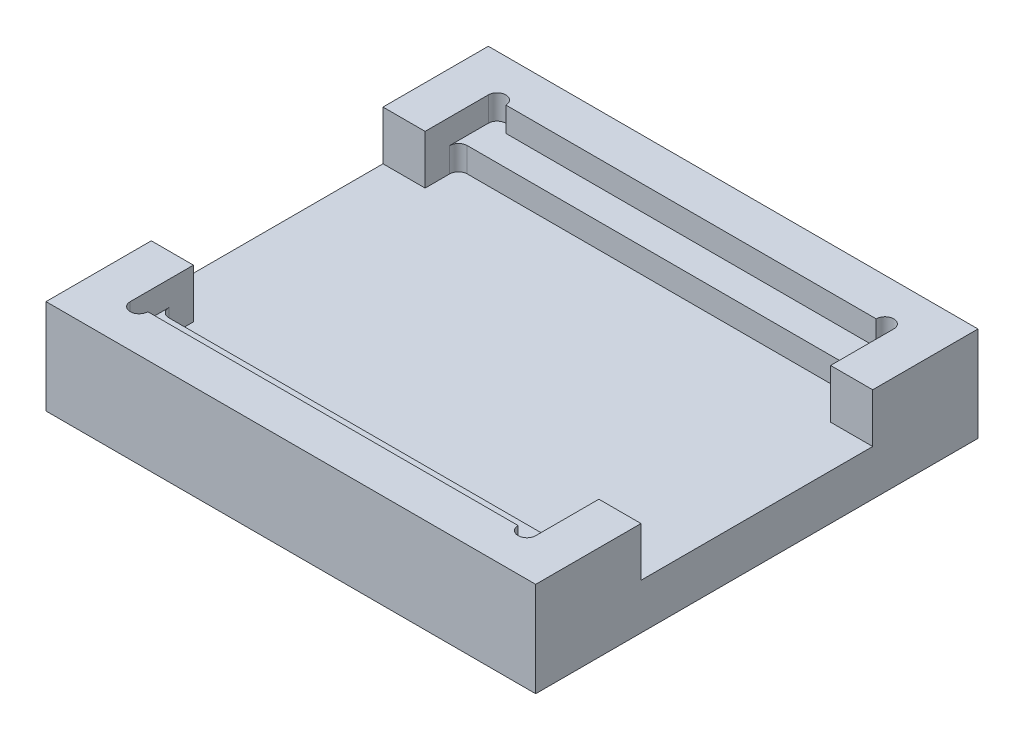
ISO-10303-21;
HEADER;
FILE_DESCRIPTION(('STEP AP214'),'2;1');
FILE_NAME('part.step','',(''),(''),'','','');
FILE_SCHEMA(('AUTOMOTIVE_DESIGN { 1 0 10303 214 1 1 1 1 }'));
ENDSEC;
DATA;
#1=APPLICATION_CONTEXT('core data for automotive mechanical design processes');
#2=APPLICATION_PROTOCOL_DEFINITION('international standard','automotive_design',2000,#1);
#3=PRODUCT_CONTEXT('',#1,'mechanical');
#4=PRODUCT('Part','Part','',(#3));
#5=PRODUCT_RELATED_PRODUCT_CATEGORY('part','',(#4));
#6=PRODUCT_DEFINITION_FORMATION('','',#4);
#7=PRODUCT_DEFINITION_CONTEXT('part definition',#1,'design');
#8=PRODUCT_DEFINITION('design','',#6,#7);
#9=PRODUCT_DEFINITION_SHAPE('','',#8);
#10=(LENGTH_UNIT() NAMED_UNIT(*) SI_UNIT(.MILLI.,.METRE.));
#11=(NAMED_UNIT(*) PLANE_ANGLE_UNIT() SI_UNIT($,.RADIAN.));
#12=(NAMED_UNIT(*) SI_UNIT($,.STERADIAN.) SOLID_ANGLE_UNIT());
#13=UNCERTAINTY_MEASURE_WITH_UNIT(LENGTH_MEASURE(1.E-05),#10,'distance_accuracy_value','');
#14=(GEOMETRIC_REPRESENTATION_CONTEXT(3) GLOBAL_UNCERTAINTY_ASSIGNED_CONTEXT((#13)) GLOBAL_UNIT_ASSIGNED_CONTEXT((#10,
#11,#12)) REPRESENTATION_CONTEXT('',''));
#15=CARTESIAN_POINT('',(0.,0.,0.));
#16=DIRECTION('',(0.,0.,1.));
#17=DIRECTION('',(1.,0.,0.));
#18=AXIS2_PLACEMENT_3D('',#15,#16,#17);
#19=CARTESIAN_POINT('',(0.,27.,0.));
#20=DIRECTION('',(0.,-1.,0.));
#21=DIRECTION('',(0.,0.,-1.));
#22=AXIS2_PLACEMENT_3D('',#19,#20,#21);
#23=PLANE('',#22);
#24=DIRECTION('',(0.,0.,-1.));
#25=VECTOR('',#24,1.);
#26=CARTESIAN_POINT('',(127.5,27.,-114.));
#27=LINE('',#26,#25);
#28=CARTESIAN_POINT('',(127.5,27.,-12.));
#29=VERTEX_POINT('',#28);
#30=CARTESIAN_POINT('',(127.5,27.,-30.));
#31=VERTEX_POINT('',#30);
#32=EDGE_CURVE('E254',#29,#31,#27,.T.);
#33=ORIENTED_EDGE('',*,*,#32,.F.);
#34=CARTESIAN_POINT('',(125.,27.,-12.));
#35=DIRECTION('',(0.,1.,0.));
#36=DIRECTION('',(0.,0.,-1.));
#37=AXIS2_PLACEMENT_3D('',#34,#35,#36);
#38=CIRCLE('',#37,2.5);
#39=CARTESIAN_POINT('',(122.5,27.,-12.));
#40=VERTEX_POINT('',#39);
#41=EDGE_CURVE('E596',#40,#29,#38,.T.);
#42=ORIENTED_EDGE('',*,*,#41,.F.);
#43=DIRECTION('',(1.,0.,0.));
#44=VECTOR('',#43,1.);
#45=CARTESIAN_POINT('',(11.9999999999999,27.,-12.));
#46=LINE('',#45,#44);
#47=CARTESIAN_POINT('',(16.9999999999999,27.,-12.));
#48=VERTEX_POINT('',#47);
#49=EDGE_CURVE('E429',#48,#40,#46,.T.);
#50=ORIENTED_EDGE('',*,*,#49,.F.);
#51=CARTESIAN_POINT('',(14.4999999999999,27.,-12.));
#52=DIRECTION('',(0.,1.,0.));
#53=DIRECTION('',(0.,0.,1.));
#54=AXIS2_PLACEMENT_3D('',#51,#52,#53);
#55=CIRCLE('',#54,2.5);
#56=CARTESIAN_POINT('',(11.9999999999999,27.,-12.));
#57=VERTEX_POINT('',#56);
#58=EDGE_CURVE('E557',#57,#48,#55,.T.);
#59=ORIENTED_EDGE('',*,*,#58,.F.);
#60=DIRECTION('',(0.,0.,1.));
#61=VECTOR('',#60,1.);
#62=CARTESIAN_POINT('',(11.9999999999999,27.,-114.));
#63=LINE('',#62,#61);
#64=CARTESIAN_POINT('',(11.9999999999999,27.,-30.));
#65=VERTEX_POINT('',#64);
#66=EDGE_CURVE('E406',#65,#57,#63,.T.);
#67=ORIENTED_EDGE('',*,*,#66,.F.);
#68=DIRECTION('',(1.,0.,0.));
#69=VECTOR('',#68,1.);
#70=CARTESIAN_POINT('',(1.37667655053519E-13,27.,-30.));
#71=LINE('',#70,#69);
#72=CARTESIAN_POINT('',(1.37667655053519E-13,27.,-30.));
#73=VERTEX_POINT('',#72);
#74=EDGE_CURVE('E504',#73,#65,#71,.T.);
#75=ORIENTED_EDGE('',*,*,#74,.F.);
#76=DIRECTION('',(0.,0.,1.));
#77=VECTOR('',#76,1.);
#78=CARTESIAN_POINT('',(0.,27.,0.));
#79=LINE('',#78,#77);
#80=CARTESIAN_POINT('',(0.,27.,0.));
#81=VERTEX_POINT('',#80);
#82=EDGE_CURVE('E283',#73,#81,#79,.T.);
#83=ORIENTED_EDGE('',*,*,#82,.T.);
#84=DIRECTION('',(1.,0.,0.));
#85=VECTOR('',#84,1.);
#86=CARTESIAN_POINT('',(0.,27.,0.));
#87=LINE('',#86,#85);
#88=CARTESIAN_POINT('',(139.5,27.,0.));
#89=VERTEX_POINT('',#88);
#90=EDGE_CURVE('E282',#81,#89,#87,.T.);
#91=ORIENTED_EDGE('',*,*,#90,.T.);
#92=DIRECTION('',(0.,0.,-1.));
#93=VECTOR('',#92,1.);
#94=CARTESIAN_POINT('',(139.5,27.,0.));
#95=LINE('',#94,#93);
#96=CARTESIAN_POINT('',(139.5,27.,-30.));
#97=VERTEX_POINT('',#96);
#98=EDGE_CURVE('E287',#89,#97,#95,.T.);
#99=ORIENTED_EDGE('',*,*,#98,.T.);
#100=DIRECTION('',(1.,0.,0.));
#101=VECTOR('',#100,1.);
#102=CARTESIAN_POINT('',(139.5,27.,-30.));
#103=LINE('',#102,#101);
#104=EDGE_CURVE('E449',#31,#97,#103,.T.);
#105=ORIENTED_EDGE('',*,*,#104,.F.);
#106=EDGE_LOOP('',(#33,#42,#50,#59,#67,#75,#83,#91,#99,#105));
#107=FACE_BOUND('',#106,.T.);
#108=ADVANCED_FACE('F39',(#107),#23,.F.);
#109=CARTESIAN_POINT('',(127.5,20.,-114.));
#110=DIRECTION('',(1.,0.,0.));
#111=DIRECTION('',(0.,0.,-1.));
#112=AXIS2_PLACEMENT_3D('',#109,#110,#111);
#113=PLANE('',#112);
#114=DIRECTION('',(0.,0.,-1.));
#115=VECTOR('',#114,1.);
#116=CARTESIAN_POINT('',(127.5,13.,-105.5));
#117=LINE('',#116,#115);
#118=CARTESIAN_POINT('',(127.5,13.,-23.));
#119=VERTEX_POINT('',#118);
#120=CARTESIAN_POINT('',(127.5,13.,-30.));
#121=VERTEX_POINT('',#120);
#122=EDGE_CURVE('E400',#119,#121,#117,.T.);
#123=ORIENTED_EDGE('',*,*,#122,.F.);
#124=DIRECTION('',(0.,1.,0.));
#125=VECTOR('',#124,1.);
#126=CARTESIAN_POINT('',(127.5,20.,-23.));
#127=LINE('',#126,#125);
#128=CARTESIAN_POINT('',(127.5,20.,-23.));
#129=VERTEX_POINT('',#128);
#130=EDGE_CURVE('E322',#119,#129,#127,.T.);
#131=ORIENTED_EDGE('',*,*,#130,.T.);
#132=DIRECTION('',(0.,0.,-1.));
#133=VECTOR('',#132,1.);
#134=CARTESIAN_POINT('',(127.5,20.,-114.));
#135=LINE('',#134,#133);
#136=CARTESIAN_POINT('',(127.5,20.,-12.));
#137=VERTEX_POINT('',#136);
#138=EDGE_CURVE('E421',#137,#129,#135,.T.);
#139=ORIENTED_EDGE('',*,*,#138,.F.);
#140=DIRECTION('',(0.,1.,0.));
#141=VECTOR('',#140,1.);
#142=CARTESIAN_POINT('',(127.5,20.,-12.));
#143=LINE('',#142,#141);
#144=EDGE_CURVE('E271',#137,#29,#143,.T.);
#145=ORIENTED_EDGE('',*,*,#144,.T.);
#146=ORIENTED_EDGE('',*,*,#32,.T.);
#147=DIRECTION('',(0.,1.,0.));
#148=VECTOR('',#147,1.);
#149=CARTESIAN_POINT('',(127.5,13.,-30.));
#150=LINE('',#149,#148);
#151=EDGE_CURVE('E527',#121,#31,#150,.T.);
#152=ORIENTED_EDGE('',*,*,#151,.F.);
#153=EDGE_LOOP('',(#123,#131,#139,#145,#146,#152));
#154=FACE_BOUND('',#153,.T.);
#155=ADVANCED_FACE('F532',(#154),#113,.F.);
#156=CARTESIAN_POINT('',(11.9999999999999,20.,-114.));
#157=DIRECTION('',(-1.,0.,0.));
#158=DIRECTION('',(0.,0.,1.));
#159=AXIS2_PLACEMENT_3D('',#156,#157,#158);
#160=PLANE('',#159);
#161=DIRECTION('',(0.,0.,1.));
#162=VECTOR('',#161,1.);
#163=CARTESIAN_POINT('',(11.9999999999999,13.,-105.5));
#164=LINE('',#163,#162);
#165=CARTESIAN_POINT('',(11.9999999999999,13.,-103.));
#166=VERTEX_POINT('',#165);
#167=CARTESIAN_POINT('',(11.9999999999999,13.,-96.));
#168=VERTEX_POINT('',#167);
#169=EDGE_CURVE('E393',#166,#168,#164,.T.);
#170=ORIENTED_EDGE('',*,*,#169,.F.);
#171=DIRECTION('',(0.,1.,0.));
#172=VECTOR('',#171,1.);
#173=CARTESIAN_POINT('',(11.9999999999999,20.,-103.));
#174=LINE('',#173,#172);
#175=CARTESIAN_POINT('',(11.9999999999999,20.,-103.));
#176=VERTEX_POINT('',#175);
#177=EDGE_CURVE('E358',#166,#176,#174,.T.);
#178=ORIENTED_EDGE('',*,*,#177,.T.);
#179=DIRECTION('',(0.,0.,1.));
#180=VECTOR('',#179,1.);
#181=CARTESIAN_POINT('',(11.9999999999999,20.,-114.));
#182=LINE('',#181,#180);
#183=CARTESIAN_POINT('',(11.9999999999999,20.,-114.));
#184=VERTEX_POINT('',#183);
#185=EDGE_CURVE('E54',#184,#176,#182,.T.);
#186=ORIENTED_EDGE('',*,*,#185,.F.);
#187=DIRECTION('',(0.,1.,0.));
#188=VECTOR('',#187,1.);
#189=CARTESIAN_POINT('',(11.9999999999999,20.,-114.));
#190=LINE('',#189,#188);
#191=CARTESIAN_POINT('',(11.9999999999999,27.,-114.));
#192=VERTEX_POINT('',#191);
#193=EDGE_CURVE('E264',#184,#192,#190,.T.);
#194=ORIENTED_EDGE('',*,*,#193,.T.);
#195=CARTESIAN_POINT('',(11.9999999999999,27.,-96.));
#196=VERTEX_POINT('',#195);
#197=EDGE_CURVE('E426',#192,#196,#63,.T.);
#198=ORIENTED_EDGE('',*,*,#197,.T.);
#199=DIRECTION('',(0.,1.,0.));
#200=VECTOR('',#199,1.);
#201=CARTESIAN_POINT('',(11.9999999999999,13.,-96.));
#202=LINE('',#201,#200);
#203=EDGE_CURVE('E484',#168,#196,#202,.T.);
#204=ORIENTED_EDGE('',*,*,#203,.F.);
#205=EDGE_LOOP('',(#170,#178,#186,#194,#198,#204));
#206=FACE_BOUND('',#205,.T.);
#207=ADVANCED_FACE('F482',(#206),#160,.F.);
#208=CARTESIAN_POINT('',(0.,20.,0.));
#209=DIRECTION('',(0.,1.,0.));
#210=DIRECTION('',(0.,0.,1.));
#211=AXIS2_PLACEMENT_3D('',#208,#209,#210);
#212=PLANE('',#211);
#213=DIRECTION('',(-1.,0.,0.));
#214=VECTOR('',#213,1.);
#215=CARTESIAN_POINT('',(127.5,20.,-105.5));
#216=LINE('',#215,#214);
#217=CARTESIAN_POINT('',(125.,20.,-105.5));
#218=VERTEX_POINT('',#217);
#219=CARTESIAN_POINT('',(14.4999999999999,20.,-105.5));
#220=VERTEX_POINT('',#219);
#221=EDGE_CURVE('E407',#218,#220,#216,.T.);
#222=ORIENTED_EDGE('',*,*,#221,.F.);
#223=CARTESIAN_POINT('',(125.,20.,-103.));
#224=DIRECTION('',(0.,1.,0.));
#225=DIRECTION('',(0.,0.,1.));
#226=AXIS2_PLACEMENT_3D('',#223,#224,#225);
#227=CIRCLE('',#226,2.5);
#228=CARTESIAN_POINT('',(127.5,20.,-103.));
#229=VERTEX_POINT('',#228);
#230=EDGE_CURVE('E365',#218,#229,#227,.F.);
#231=ORIENTED_EDGE('',*,*,#230,.T.);
#232=CARTESIAN_POINT('',(127.5,20.,-114.));
#233=VERTEX_POINT('',#232);
#234=EDGE_CURVE('E420',#229,#233,#135,.T.);
#235=ORIENTED_EDGE('',*,*,#234,.T.);
#236=CARTESIAN_POINT('',(125.,20.,-114.));
#237=DIRECTION('',(0.,1.,0.));
#238=DIRECTION('',(0.,0.,1.));
#239=AXIS2_PLACEMENT_3D('',#236,#237,#238);
#240=CIRCLE('',#239,2.5);
#241=CARTESIAN_POINT('',(122.5,20.,-114.));
#242=VERTEX_POINT('',#241);
#243=EDGE_CURVE('E247',#242,#233,#240,.F.);
#244=ORIENTED_EDGE('',*,*,#243,.F.);
#245=DIRECTION('',(-1.,0.,0.));
#246=VECTOR('',#245,1.);
#247=CARTESIAN_POINT('',(11.9999999999999,20.,-114.));
#248=LINE('',#247,#246);
#249=CARTESIAN_POINT('',(16.9999999999999,20.,-114.));
#250=VERTEX_POINT('',#249);
#251=EDGE_CURVE('E245',#242,#250,#248,.T.);
#252=ORIENTED_EDGE('',*,*,#251,.T.);
#253=CARTESIAN_POINT('',(14.4999999999999,20.,-114.));
#254=DIRECTION('',(0.,1.,0.));
#255=DIRECTION('',(0.,0.,1.));
#256=AXIS2_PLACEMENT_3D('',#253,#254,#255);
#257=CIRCLE('',#256,2.5);
#258=EDGE_CURVE('E594',#184,#250,#257,.F.);
#259=ORIENTED_EDGE('',*,*,#258,.F.);
#260=ORIENTED_EDGE('',*,*,#185,.T.);
#261=CARTESIAN_POINT('',(14.4999999999999,20.,-103.));
#262=DIRECTION('',(0.,1.,0.));
#263=DIRECTION('',(0.,0.,1.));
#264=AXIS2_PLACEMENT_3D('',#261,#262,#263);
#265=CIRCLE('',#264,2.5);
#266=EDGE_CURVE('E11',#176,#220,#265,.F.);
#267=ORIENTED_EDGE('',*,*,#266,.T.);
#268=EDGE_LOOP('',(#222,#231,#235,#244,#252,#259,#260,#267));
#269=FACE_BOUND('',#268,.T.);
#270=ADVANCED_FACE('F463',(#269),#212,.T.);
#271=CARTESIAN_POINT('',(0.,27.,0.));
#272=DIRECTION('',(1.,0.,0.));
#273=DIRECTION('',(0.,0.,-1.));
#274=AXIS2_PLACEMENT_3D('',#271,#272,#273);
#275=PLANE('',#274);
#276=DIRECTION('',(0.,0.,1.));
#277=VECTOR('',#276,1.);
#278=CARTESIAN_POINT('',(1.37667655053519E-13,13.,-30.));
#279=LINE('',#278,#277);
#280=CARTESIAN_POINT('',(0.,13.,-96.));
#281=VERTEX_POINT('',#280);
#282=CARTESIAN_POINT('',(1.37667655053519E-13,13.,-30.));
#283=VERTEX_POINT('',#282);
#284=EDGE_CURVE('E500',#281,#283,#279,.T.);
#285=ORIENTED_EDGE('',*,*,#284,.F.);
#286=DIRECTION('',(0.,1.,0.));
#287=VECTOR('',#286,1.);
#288=CARTESIAN_POINT('',(0.,13.,-96.));
#289=LINE('',#288,#287);
#290=CARTESIAN_POINT('',(0.,27.,-96.));
#291=VERTEX_POINT('',#290);
#292=EDGE_CURVE('E411',#281,#291,#289,.T.);
#293=ORIENTED_EDGE('',*,*,#292,.T.);
#294=CARTESIAN_POINT('',(0.,27.,-126.));
#295=VERTEX_POINT('',#294);
#296=EDGE_CURVE('E278',#295,#291,#79,.T.);
#297=ORIENTED_EDGE('',*,*,#296,.F.);
#298=DIRECTION('',(0.,-1.,0.));
#299=VECTOR('',#298,1.);
#300=CARTESIAN_POINT('',(0.,27.,-126.));
#301=LINE('',#300,#299);
#302=CARTESIAN_POINT('',(0.,0.,-126.));
#303=VERTEX_POINT('',#302);
#304=EDGE_CURVE('E294',#295,#303,#301,.T.);
#305=ORIENTED_EDGE('',*,*,#304,.T.);
#306=DIRECTION('',(0.,0.,1.));
#307=VECTOR('',#306,1.);
#308=CARTESIAN_POINT('',(0.,0.,0.));
#309=LINE('',#308,#307);
#310=CARTESIAN_POINT('',(0.,0.,0.));
#311=VERTEX_POINT('',#310);
#312=EDGE_CURVE('E268',#303,#311,#309,.T.);
#313=ORIENTED_EDGE('',*,*,#312,.T.);
#314=DIRECTION('',(0.,-1.,0.));
#315=VECTOR('',#314,1.);
#316=CARTESIAN_POINT('',(0.,27.,0.));
#317=LINE('',#316,#315);
#318=EDGE_CURVE('E318',#81,#311,#317,.T.);
#319=ORIENTED_EDGE('',*,*,#318,.F.);
#320=ORIENTED_EDGE('',*,*,#82,.F.);
#321=DIRECTION('',(0.,1.,0.));
#322=VECTOR('',#321,1.);
#323=CARTESIAN_POINT('',(1.37667655053519E-13,13.,-30.));
#324=LINE('',#323,#322);
#325=EDGE_CURVE('E494',#283,#73,#324,.T.);
#326=ORIENTED_EDGE('',*,*,#325,.F.);
#327=EDGE_LOOP('',(#285,#293,#297,#305,#313,#319,#320,#326));
#328=FACE_BOUND('',#327,.T.);
#329=ADVANCED_FACE('F547',(#328),#275,.F.);
#330=CARTESIAN_POINT('',(0.,27.,0.));
#331=DIRECTION('',(0.,0.,-1.));
#332=DIRECTION('',(-1.,0.,0.));
#333=AXIS2_PLACEMENT_3D('',#330,#331,#332);
#334=PLANE('',#333);
#335=DIRECTION('',(1.,0.,0.));
#336=VECTOR('',#335,1.);
#337=CARTESIAN_POINT('',(0.,0.,0.));
#338=LINE('',#337,#336);
#339=CARTESIAN_POINT('',(139.5,0.,0.));
#340=VERTEX_POINT('',#339);
#341=EDGE_CURVE('E298',#311,#340,#338,.T.);
#342=ORIENTED_EDGE('',*,*,#341,.T.);
#343=DIRECTION('',(0.,-1.,0.));
#344=VECTOR('',#343,1.);
#345=CARTESIAN_POINT('',(139.5,27.,0.));
#346=LINE('',#345,#344);
#347=EDGE_CURVE('E314',#89,#340,#346,.T.);
#348=ORIENTED_EDGE('',*,*,#347,.F.);
#349=ORIENTED_EDGE('',*,*,#90,.F.);
#350=ORIENTED_EDGE('',*,*,#318,.T.);
#351=EDGE_LOOP('',(#342,#348,#349,#350));
#352=FACE_BOUND('',#351,.T.);
#353=ADVANCED_FACE('F582',(#352),#334,.F.);
#354=CARTESIAN_POINT('',(139.5,27.,0.));
#355=DIRECTION('',(-1.,0.,0.));
#356=DIRECTION('',(0.,0.,1.));
#357=AXIS2_PLACEMENT_3D('',#354,#355,#356);
#358=PLANE('',#357);
#359=DIRECTION('',(0.,0.,-1.));
#360=VECTOR('',#359,1.);
#361=CARTESIAN_POINT('',(139.5,13.,-96.));
#362=LINE('',#361,#360);
#363=CARTESIAN_POINT('',(139.5,13.,-30.));
#364=VERTEX_POINT('',#363);
#365=CARTESIAN_POINT('',(139.5,13.,-96.));
#366=VERTEX_POINT('',#365);
#367=EDGE_CURVE('E574',#364,#366,#362,.T.);
#368=ORIENTED_EDGE('',*,*,#367,.F.);
#369=DIRECTION('',(0.,1.,0.));
#370=VECTOR('',#369,1.);
#371=CARTESIAN_POINT('',(139.5,13.,-30.));
#372=LINE('',#371,#370);
#373=EDGE_CURVE('E508',#364,#97,#372,.T.);
#374=ORIENTED_EDGE('',*,*,#373,.T.);
#375=ORIENTED_EDGE('',*,*,#98,.F.);
#376=ORIENTED_EDGE('',*,*,#347,.T.);
#377=DIRECTION('',(0.,0.,-1.));
#378=VECTOR('',#377,1.);
#379=CARTESIAN_POINT('',(139.5,0.,0.));
#380=LINE('',#379,#378);
#381=CARTESIAN_POINT('',(139.5,0.,-126.));
#382=VERTEX_POINT('',#381);
#383=EDGE_CURVE('E301',#340,#382,#380,.T.);
#384=ORIENTED_EDGE('',*,*,#383,.T.);
#385=DIRECTION('',(0.,-1.,0.));
#386=VECTOR('',#385,1.);
#387=CARTESIAN_POINT('',(139.5,27.,-126.));
#388=LINE('',#387,#386);
#389=CARTESIAN_POINT('',(139.5,27.,-126.));
#390=VERTEX_POINT('',#389);
#391=EDGE_CURVE('E310',#390,#382,#388,.T.);
#392=ORIENTED_EDGE('',*,*,#391,.F.);
#393=CARTESIAN_POINT('',(139.5,27.,-96.));
#394=VERTEX_POINT('',#393);
#395=EDGE_CURVE('E286',#394,#390,#95,.T.);
#396=ORIENTED_EDGE('',*,*,#395,.F.);
#397=DIRECTION('',(0.,1.,0.));
#398=VECTOR('',#397,1.);
#399=CARTESIAN_POINT('',(139.5,13.,-96.));
#400=LINE('',#399,#398);
#401=EDGE_CURVE('E456',#366,#394,#400,.T.);
#402=ORIENTED_EDGE('',*,*,#401,.F.);
#403=EDGE_LOOP('',(#368,#374,#375,#376,#384,#392,#396,#402));
#404=FACE_BOUND('',#403,.T.);
#405=ADVANCED_FACE('F455',(#404),#358,.F.);
#406=CARTESIAN_POINT('',(0.,27.,-126.));
#407=DIRECTION('',(0.,0.,1.));
#408=DIRECTION('',(1.,0.,0.));
#409=AXIS2_PLACEMENT_3D('',#406,#407,#408);
#410=PLANE('',#409);
#411=DIRECTION('',(-1.,0.,0.));
#412=VECTOR('',#411,1.);
#413=CARTESIAN_POINT('',(0.,0.,-126.));
#414=LINE('',#413,#412);
#415=EDGE_CURVE('E304',#382,#303,#414,.T.);
#416=ORIENTED_EDGE('',*,*,#415,.T.);
#417=ORIENTED_EDGE('',*,*,#304,.F.);
#418=DIRECTION('',(-1.,0.,0.));
#419=VECTOR('',#418,1.);
#420=CARTESIAN_POINT('',(0.,27.,-126.));
#421=LINE('',#420,#419);
#422=EDGE_CURVE('E291',#390,#295,#421,.T.);
#423=ORIENTED_EDGE('',*,*,#422,.F.);
#424=ORIENTED_EDGE('',*,*,#391,.T.);
#425=EDGE_LOOP('',(#416,#417,#423,#424));
#426=FACE_BOUND('',#425,.T.);
#427=ADVANCED_FACE('F590',(#426),#410,.F.);
#428=ORIENTED_EDGE('',*,*,#197,.F.);
#429=CARTESIAN_POINT('',(14.4999999999999,27.,-114.));
#430=DIRECTION('',(0.,1.,0.));
#431=DIRECTION('',(0.,0.,-1.));
#432=AXIS2_PLACEMENT_3D('',#429,#430,#431);
#433=CIRCLE('',#432,2.5);
#434=CARTESIAN_POINT('',(16.9999999999999,27.,-114.));
#435=VERTEX_POINT('',#434);
#436=EDGE_CURVE('E252',#435,#192,#433,.T.);
#437=ORIENTED_EDGE('',*,*,#436,.F.);
#438=DIRECTION('',(-1.,0.,0.));
#439=VECTOR('',#438,1.);
#440=CARTESIAN_POINT('',(11.9999999999999,27.,-114.));
#441=LINE('',#440,#439);
#442=CARTESIAN_POINT('',(122.5,27.,-114.));
#443=VERTEX_POINT('',#442);
#444=EDGE_CURVE('E243',#443,#435,#441,.T.);
#445=ORIENTED_EDGE('',*,*,#444,.F.);
#446=CARTESIAN_POINT('',(125.,27.,-114.));
#447=DIRECTION('',(0.,1.,0.));
#448=DIRECTION('',(0.,0.,1.));
#449=AXIS2_PLACEMENT_3D('',#446,#447,#448);
#450=CIRCLE('',#449,2.5);
#451=CARTESIAN_POINT('',(127.5,27.,-114.));
#452=VERTEX_POINT('',#451);
#453=EDGE_CURVE('E226',#452,#443,#450,.T.);
#454=ORIENTED_EDGE('',*,*,#453,.F.);
#455=CARTESIAN_POINT('',(127.5,27.,-96.));
#456=VERTEX_POINT('',#455);
#457=EDGE_CURVE('E260',#456,#452,#27,.T.);
#458=ORIENTED_EDGE('',*,*,#457,.F.);
#459=DIRECTION('',(-1.,0.,0.));
#460=VECTOR('',#459,1.);
#461=CARTESIAN_POINT('',(139.5,27.,-96.));
#462=LINE('',#461,#460);
#463=EDGE_CURVE('E444',#394,#456,#462,.T.);
#464=ORIENTED_EDGE('',*,*,#463,.F.);
#465=ORIENTED_EDGE('',*,*,#395,.T.);
#466=ORIENTED_EDGE('',*,*,#422,.T.);
#467=ORIENTED_EDGE('',*,*,#296,.T.);
#468=DIRECTION('',(-1.,0.,0.));
#469=VECTOR('',#468,1.);
#470=CARTESIAN_POINT('',(0.,27.,-96.));
#471=LINE('',#470,#469);
#472=EDGE_CURVE('E507',#196,#291,#471,.T.);
#473=ORIENTED_EDGE('',*,*,#472,.F.);
#474=EDGE_LOOP('',(#428,#437,#445,#454,#458,#464,#465,#466,#467,#473));
#475=FACE_BOUND('',#474,.T.);
#476=ADVANCED_FACE('F251',(#475),#23,.F.);
#477=CARTESIAN_POINT('',(0.,0.,0.));
#478=DIRECTION('',(0.,-1.,0.));
#479=DIRECTION('',(0.,0.,-1.));
#480=AXIS2_PLACEMENT_3D('',#477,#478,#479);
#481=PLANE('',#480);
#482=ORIENTED_EDGE('',*,*,#312,.F.);
#483=ORIENTED_EDGE('',*,*,#415,.F.);
#484=ORIENTED_EDGE('',*,*,#383,.F.);
#485=ORIENTED_EDGE('',*,*,#341,.F.);
#486=EDGE_LOOP('',(#482,#483,#484,#485));
#487=FACE_BOUND('',#486,.T.);
#488=ADVANCED_FACE('F587',(#487),#481,.T.);
#489=CARTESIAN_POINT('',(11.9999999999999,20.,-23.));
#490=VERTEX_POINT('',#489);
#491=CARTESIAN_POINT('',(11.9999999999999,20.,-12.));
#492=VERTEX_POINT('',#491);
#493=EDGE_CURVE('E62',#490,#492,#182,.T.);
#494=ORIENTED_EDGE('',*,*,#493,.F.);
#495=DIRECTION('',(0.,1.,0.));
#496=VECTOR('',#495,1.);
#497=CARTESIAN_POINT('',(11.9999999999999,13.,-23.));
#498=LINE('',#497,#496);
#499=CARTESIAN_POINT('',(11.9999999999999,13.,-23.));
#500=VERTEX_POINT('',#499);
#501=EDGE_CURVE('E355',#490,#500,#498,.F.);
#502=ORIENTED_EDGE('',*,*,#501,.T.);
#503=CARTESIAN_POINT('',(11.9999999999999,13.,-30.));
#504=VERTEX_POINT('',#503);
#505=EDGE_CURVE('E384',#504,#500,#164,.T.);
#506=ORIENTED_EDGE('',*,*,#505,.F.);
#507=DIRECTION('',(0.,1.,0.));
#508=VECTOR('',#507,1.);
#509=CARTESIAN_POINT('',(11.9999999999999,13.,-30.));
#510=LINE('',#509,#508);
#511=EDGE_CURVE('E498',#504,#65,#510,.T.);
#512=ORIENTED_EDGE('',*,*,#511,.T.);
#513=ORIENTED_EDGE('',*,*,#66,.T.);
#514=DIRECTION('',(0.,1.,0.));
#515=VECTOR('',#514,1.);
#516=CARTESIAN_POINT('',(11.9999999999999,20.,-12.));
#517=LINE('',#516,#515);
#518=EDGE_CURVE('E275',#492,#57,#517,.T.);
#519=ORIENTED_EDGE('',*,*,#518,.F.);
#520=EDGE_LOOP('',(#494,#502,#506,#512,#513,#519));
#521=FACE_BOUND('',#520,.T.);
#522=ADVANCED_FACE('F382',(#521),#160,.F.);
#523=CARTESIAN_POINT('',(11.9999999999999,20.,-114.));
#524=DIRECTION('',(0.,0.,-1.));
#525=DIRECTION('',(-1.,0.,0.));
#526=AXIS2_PLACEMENT_3D('',#523,#524,#525);
#527=PLANE('',#526);
#528=ORIENTED_EDGE('',*,*,#444,.T.);
#529=DIRECTION('',(0.,1.,0.));
#530=VECTOR('',#529,1.);
#531=CARTESIAN_POINT('',(16.9999999999999,14.4098300562505,-114.));
#532=LINE('',#531,#530);
#533=EDGE_CURVE('E569',#250,#435,#532,.T.);
#534=ORIENTED_EDGE('',*,*,#533,.F.);
#535=ORIENTED_EDGE('',*,*,#251,.F.);
#536=DIRECTION('',(0.,1.,0.));
#537=VECTOR('',#536,1.);
#538=CARTESIAN_POINT('',(122.5,14.4098300562505,-114.));
#539=LINE('',#538,#537);
#540=EDGE_CURVE('E229',#242,#443,#539,.T.);
#541=ORIENTED_EDGE('',*,*,#540,.T.);
#542=EDGE_LOOP('',(#528,#534,#535,#541));
#543=FACE_BOUND('',#542,.T.);
#544=ADVANCED_FACE('F241',(#543),#527,.F.);
#545=ORIENTED_EDGE('',*,*,#234,.F.);
#546=DIRECTION('',(0.,1.,0.));
#547=VECTOR('',#546,1.);
#548=CARTESIAN_POINT('',(127.5,13.,-103.));
#549=LINE('',#548,#547);
#550=CARTESIAN_POINT('',(127.5,13.,-103.));
#551=VERTEX_POINT('',#550);
#552=EDGE_CURVE('E352',#229,#551,#549,.F.);
#553=ORIENTED_EDGE('',*,*,#552,.T.);
#554=CARTESIAN_POINT('',(127.5,13.,-96.));
#555=VERTEX_POINT('',#554);
#556=EDGE_CURVE('E413',#555,#551,#117,.T.);
#557=ORIENTED_EDGE('',*,*,#556,.F.);
#558=DIRECTION('',(0.,1.,0.));
#559=VECTOR('',#558,1.);
#560=CARTESIAN_POINT('',(127.5,13.,-96.));
#561=LINE('',#560,#559);
#562=EDGE_CURVE('E442',#555,#456,#561,.T.);
#563=ORIENTED_EDGE('',*,*,#562,.T.);
#564=ORIENTED_EDGE('',*,*,#457,.T.);
#565=DIRECTION('',(0.,1.,0.));
#566=VECTOR('',#565,1.);
#567=CARTESIAN_POINT('',(127.5,20.,-114.));
#568=LINE('',#567,#566);
#569=EDGE_CURVE('E232',#233,#452,#568,.T.);
#570=ORIENTED_EDGE('',*,*,#569,.F.);
#571=EDGE_LOOP('',(#545,#553,#557,#563,#564,#570));
#572=FACE_BOUND('',#571,.T.);
#573=ADVANCED_FACE('F439',(#572),#113,.F.);
#574=CARTESIAN_POINT('',(11.9999999999999,20.,-12.));
#575=DIRECTION('',(0.,0.,1.));
#576=DIRECTION('',(1.,0.,0.));
#577=AXIS2_PLACEMENT_3D('',#574,#575,#576);
#578=PLANE('',#577);
#579=ORIENTED_EDGE('',*,*,#49,.T.);
#580=DIRECTION('',(0.,1.,0.));
#581=VECTOR('',#580,1.);
#582=CARTESIAN_POINT('',(122.5,14.4098300562505,-12.));
#583=LINE('',#582,#581);
#584=CARTESIAN_POINT('',(122.5,20.,-12.));
#585=VERTEX_POINT('',#584);
#586=EDGE_CURVE('E600',#585,#40,#583,.T.);
#587=ORIENTED_EDGE('',*,*,#586,.F.);
#588=DIRECTION('',(1.,0.,0.));
#589=VECTOR('',#588,1.);
#590=CARTESIAN_POINT('',(11.9999999999999,20.,-12.));
#591=LINE('',#590,#589);
#592=CARTESIAN_POINT('',(16.9999999999999,20.,-12.));
#593=VERTEX_POINT('',#592);
#594=EDGE_CURVE('E416',#593,#585,#591,.T.);
#595=ORIENTED_EDGE('',*,*,#594,.F.);
#596=DIRECTION('',(0.,1.,0.));
#597=VECTOR('',#596,1.);
#598=CARTESIAN_POINT('',(16.9999999999999,14.4098300562505,-12.));
#599=LINE('',#598,#597);
#600=EDGE_CURVE('E561',#593,#48,#599,.T.);
#601=ORIENTED_EDGE('',*,*,#600,.T.);
#602=EDGE_LOOP('',(#579,#587,#595,#601));
#603=FACE_BOUND('',#602,.T.);
#604=ADVANCED_FACE('F613',(#603),#578,.F.);
#605=DIRECTION('',(1.,0.,0.));
#606=VECTOR('',#605,1.);
#607=CARTESIAN_POINT('',(127.5,20.,-20.5));
#608=LINE('',#607,#606);
#609=CARTESIAN_POINT('',(14.4999999999999,20.,-20.5));
#610=VERTEX_POINT('',#609);
#611=CARTESIAN_POINT('',(125.,20.,-20.5));
#612=VERTEX_POINT('',#611);
#613=EDGE_CURVE('E375',#610,#612,#608,.T.);
#614=ORIENTED_EDGE('',*,*,#613,.F.);
#615=CARTESIAN_POINT('',(14.4999999999999,20.,-23.));
#616=DIRECTION('',(0.,1.,0.));
#617=DIRECTION('',(0.,0.,1.));
#618=AXIS2_PLACEMENT_3D('',#615,#616,#617);
#619=CIRCLE('',#618,2.5);
#620=EDGE_CURVE('E48',#610,#490,#619,.F.);
#621=ORIENTED_EDGE('',*,*,#620,.T.);
#622=ORIENTED_EDGE('',*,*,#493,.T.);
#623=CARTESIAN_POINT('',(14.4999999999999,20.,-12.));
#624=DIRECTION('',(0.,1.,0.));
#625=DIRECTION('',(0.,0.,1.));
#626=AXIS2_PLACEMENT_3D('',#623,#624,#625);
#627=CIRCLE('',#626,2.5);
#628=EDGE_CURVE('E450',#593,#492,#627,.F.);
#629=ORIENTED_EDGE('',*,*,#628,.F.);
#630=ORIENTED_EDGE('',*,*,#594,.T.);
#631=CARTESIAN_POINT('',(125.,20.,-12.));
#632=DIRECTION('',(0.,1.,0.));
#633=DIRECTION('',(0.,0.,1.));
#634=AXIS2_PLACEMENT_3D('',#631,#632,#633);
#635=CIRCLE('',#634,2.5);
#636=EDGE_CURVE('E572',#137,#585,#635,.F.);
#637=ORIENTED_EDGE('',*,*,#636,.F.);
#638=ORIENTED_EDGE('',*,*,#138,.T.);
#639=CARTESIAN_POINT('',(125.,20.,-23.));
#640=DIRECTION('',(0.,1.,0.));
#641=DIRECTION('',(0.,0.,1.));
#642=AXIS2_PLACEMENT_3D('',#639,#640,#641);
#643=CIRCLE('',#642,2.5);
#644=EDGE_CURVE('E362',#129,#612,#643,.F.);
#645=ORIENTED_EDGE('',*,*,#644,.T.);
#646=EDGE_LOOP('',(#614,#621,#622,#629,#630,#637,#638,#645));
#647=FACE_BOUND('',#646,.T.);
#648=ADVANCED_FACE('F372',(#647),#212,.T.);
#649=CARTESIAN_POINT('',(127.5,13.,-20.5));
#650=DIRECTION('',(0.,0.,1.));
#651=DIRECTION('',(1.,0.,0.));
#652=AXIS2_PLACEMENT_3D('',#649,#650,#651);
#653=PLANE('',#652);
#654=ORIENTED_EDGE('',*,*,#613,.T.);
#655=DIRECTION('',(0.,1.,0.));
#656=VECTOR('',#655,1.);
#657=CARTESIAN_POINT('',(125.,13.,-20.5));
#658=LINE('',#657,#656);
#659=CARTESIAN_POINT('',(125.,13.,-20.5));
#660=VERTEX_POINT('',#659);
#661=EDGE_CURVE('E330',#612,#660,#658,.F.);
#662=ORIENTED_EDGE('',*,*,#661,.T.);
#663=DIRECTION('',(1.,0.,0.));
#664=VECTOR('',#663,1.);
#665=CARTESIAN_POINT('',(127.5,13.,-20.5));
#666=LINE('',#665,#664);
#667=CARTESIAN_POINT('',(14.4999999999999,13.,-20.5));
#668=VERTEX_POINT('',#667);
#669=EDGE_CURVE('E398',#668,#660,#666,.T.);
#670=ORIENTED_EDGE('',*,*,#669,.F.);
#671=DIRECTION('',(0.,1.,0.));
#672=VECTOR('',#671,1.);
#673=CARTESIAN_POINT('',(14.4999999999999,20.,-20.5));
#674=LINE('',#673,#672);
#675=EDGE_CURVE('E326',#668,#610,#674,.T.);
#676=ORIENTED_EDGE('',*,*,#675,.T.);
#677=EDGE_LOOP('',(#654,#662,#670,#676));
#678=FACE_BOUND('',#677,.T.);
#679=ADVANCED_FACE('F620',(#678),#653,.F.);
#680=CARTESIAN_POINT('',(127.5,13.,-105.5));
#681=DIRECTION('',(0.,0.,-1.));
#682=DIRECTION('',(-1.,0.,0.));
#683=AXIS2_PLACEMENT_3D('',#680,#681,#682);
#684=PLANE('',#683);
#685=DIRECTION('',(-1.,0.,0.));
#686=VECTOR('',#685,1.);
#687=CARTESIAN_POINT('',(127.5,13.,-105.5));
#688=LINE('',#687,#686);
#689=CARTESIAN_POINT('',(125.,13.,-105.5));
#690=VERTEX_POINT('',#689);
#691=CARTESIAN_POINT('',(14.4999999999999,13.,-105.5));
#692=VERTEX_POINT('',#691);
#693=EDGE_CURVE('E394',#690,#692,#688,.T.);
#694=ORIENTED_EDGE('',*,*,#693,.F.);
#695=DIRECTION('',(0.,1.,0.));
#696=VECTOR('',#695,1.);
#697=CARTESIAN_POINT('',(125.,20.,-105.5));
#698=LINE('',#697,#696);
#699=EDGE_CURVE('E348',#690,#218,#698,.T.);
#700=ORIENTED_EDGE('',*,*,#699,.T.);
#701=ORIENTED_EDGE('',*,*,#221,.T.);
#702=DIRECTION('',(0.,1.,0.));
#703=VECTOR('',#702,1.);
#704=CARTESIAN_POINT('',(14.4999999999999,13.,-105.5));
#705=LINE('',#704,#703);
#706=EDGE_CURVE('E345',#220,#692,#705,.F.);
#707=ORIENTED_EDGE('',*,*,#706,.T.);
#708=EDGE_LOOP('',(#694,#700,#701,#707));
#709=FACE_BOUND('',#708,.T.);
#710=ADVANCED_FACE('F475',(#709),#684,.F.);
#711=CARTESIAN_POINT('',(0.,13.,0.));
#712=DIRECTION('',(0.,-1.,0.));
#713=DIRECTION('',(0.,0.,-1.));
#714=AXIS2_PLACEMENT_3D('',#711,#712,#713);
#715=PLANE('',#714);
#716=ORIENTED_EDGE('',*,*,#669,.T.);
#717=CARTESIAN_POINT('',(125.,13.,-23.));
#718=DIRECTION('',(0.,-1.,0.));
#719=DIRECTION('',(0.,0.,-1.));
#720=AXIS2_PLACEMENT_3D('',#717,#718,#719);
#721=CIRCLE('',#720,2.5);
#722=EDGE_CURVE('E342',#660,#119,#721,.F.);
#723=ORIENTED_EDGE('',*,*,#722,.T.);
#724=ORIENTED_EDGE('',*,*,#122,.T.);
#725=DIRECTION('',(1.,0.,0.));
#726=VECTOR('',#725,1.);
#727=CARTESIAN_POINT('',(139.5,13.,-30.));
#728=LINE('',#727,#726);
#729=EDGE_CURVE('E520',#121,#364,#728,.T.);
#730=ORIENTED_EDGE('',*,*,#729,.T.);
#731=ORIENTED_EDGE('',*,*,#367,.T.);
#732=DIRECTION('',(-1.,0.,0.));
#733=VECTOR('',#732,1.);
#734=CARTESIAN_POINT('',(139.5,13.,-96.));
#735=LINE('',#734,#733);
#736=EDGE_CURVE('E470',#366,#555,#735,.T.);
#737=ORIENTED_EDGE('',*,*,#736,.T.);
#738=ORIENTED_EDGE('',*,*,#556,.T.);
#739=CARTESIAN_POINT('',(125.,13.,-103.));
#740=DIRECTION('',(0.,-1.,0.));
#741=DIRECTION('',(0.,0.,-1.));
#742=AXIS2_PLACEMENT_3D('',#739,#740,#741);
#743=CIRCLE('',#742,2.5);
#744=EDGE_CURVE('E339',#551,#690,#743,.F.);
#745=ORIENTED_EDGE('',*,*,#744,.T.);
#746=ORIENTED_EDGE('',*,*,#693,.T.);
#747=CARTESIAN_POINT('',(14.4999999999999,13.,-103.));
#748=DIRECTION('',(0.,-1.,0.));
#749=DIRECTION('',(0.,0.,-1.));
#750=AXIS2_PLACEMENT_3D('',#747,#748,#749);
#751=CIRCLE('',#750,2.5);
#752=EDGE_CURVE('E333',#692,#166,#751,.F.);
#753=ORIENTED_EDGE('',*,*,#752,.T.);
#754=ORIENTED_EDGE('',*,*,#169,.T.);
#755=DIRECTION('',(-1.,0.,0.));
#756=VECTOR('',#755,1.);
#757=CARTESIAN_POINT('',(0.,13.,-96.));
#758=LINE('',#757,#756);
#759=EDGE_CURVE('E487',#168,#281,#758,.T.);
#760=ORIENTED_EDGE('',*,*,#759,.T.);
#761=ORIENTED_EDGE('',*,*,#284,.T.);
#762=DIRECTION('',(1.,0.,0.));
#763=VECTOR('',#762,1.);
#764=CARTESIAN_POINT('',(1.37667655053519E-13,13.,-30.));
#765=LINE('',#764,#763);
#766=EDGE_CURVE('E390',#283,#504,#765,.T.);
#767=ORIENTED_EDGE('',*,*,#766,.T.);
#768=ORIENTED_EDGE('',*,*,#505,.T.);
#769=CARTESIAN_POINT('',(14.4999999999999,13.,-23.));
#770=DIRECTION('',(0.,-1.,0.));
#771=DIRECTION('',(0.,0.,-1.));
#772=AXIS2_PLACEMENT_3D('',#769,#770,#771);
#773=CIRCLE('',#772,2.5);
#774=EDGE_CURVE('E336',#500,#668,#773,.F.);
#775=ORIENTED_EDGE('',*,*,#774,.T.);
#776=EDGE_LOOP('',(#716,#723,#724,#730,#731,#737,#738,#745,#746,#753,#754,#760,#761,#767,#768,#775));
#777=FACE_BOUND('',#776,.T.);
#778=ADVANCED_FACE('F387',(#777),#715,.F.);
#779=CARTESIAN_POINT('',(0.,13.,-96.));
#780=DIRECTION('',(0.,0.,-1.));
#781=DIRECTION('',(-1.,0.,0.));
#782=AXIS2_PLACEMENT_3D('',#779,#780,#781);
#783=PLANE('',#782);
#784=ORIENTED_EDGE('',*,*,#472,.T.);
#785=ORIENTED_EDGE('',*,*,#292,.F.);
#786=ORIENTED_EDGE('',*,*,#759,.F.);
#787=ORIENTED_EDGE('',*,*,#203,.T.);
#788=EDGE_LOOP('',(#784,#785,#786,#787));
#789=FACE_BOUND('',#788,.T.);
#790=ADVANCED_FACE('F490',(#789),#783,.F.);
#791=CARTESIAN_POINT('',(1.37667655053519E-13,13.,-30.));
#792=DIRECTION('',(0.,0.,1.));
#793=DIRECTION('',(1.,0.,0.));
#794=AXIS2_PLACEMENT_3D('',#791,#792,#793);
#795=PLANE('',#794);
#796=ORIENTED_EDGE('',*,*,#74,.T.);
#797=ORIENTED_EDGE('',*,*,#511,.F.);
#798=ORIENTED_EDGE('',*,*,#766,.F.);
#799=ORIENTED_EDGE('',*,*,#325,.T.);
#800=EDGE_LOOP('',(#796,#797,#798,#799));
#801=FACE_BOUND('',#800,.T.);
#802=ADVANCED_FACE('F551',(#801),#795,.F.);
#803=CARTESIAN_POINT('',(139.5,13.,-30.));
#804=DIRECTION('',(0.,0.,1.));
#805=DIRECTION('',(1.,0.,0.));
#806=AXIS2_PLACEMENT_3D('',#803,#804,#805);
#807=PLANE('',#806);
#808=ORIENTED_EDGE('',*,*,#104,.T.);
#809=ORIENTED_EDGE('',*,*,#373,.F.);
#810=ORIENTED_EDGE('',*,*,#729,.F.);
#811=ORIENTED_EDGE('',*,*,#151,.T.);
#812=EDGE_LOOP('',(#808,#809,#810,#811));
#813=FACE_BOUND('',#812,.T.);
#814=ADVANCED_FACE('F526',(#813),#807,.F.);
#815=CARTESIAN_POINT('',(139.5,13.,-96.));
#816=DIRECTION('',(0.,0.,-1.));
#817=DIRECTION('',(-1.,0.,0.));
#818=AXIS2_PLACEMENT_3D('',#815,#816,#817);
#819=PLANE('',#818);
#820=ORIENTED_EDGE('',*,*,#463,.T.);
#821=ORIENTED_EDGE('',*,*,#562,.F.);
#822=ORIENTED_EDGE('',*,*,#736,.F.);
#823=ORIENTED_EDGE('',*,*,#401,.T.);
#824=EDGE_LOOP('',(#820,#821,#822,#823));
#825=FACE_BOUND('',#824,.T.);
#826=ADVANCED_FACE('F782',(#825),#819,.F.);
#827=CARTESIAN_POINT('',(14.4999999999999,14.4098300562505,-12.));
#828=DIRECTION('',(0.,1.,0.));
#829=DIRECTION('',(0.,0.,1.));
#830=AXIS2_PLACEMENT_3D('',#827,#828,#829);
#831=CYLINDRICAL_SURFACE('',#830,2.5);
#832=ORIENTED_EDGE('',*,*,#628,.T.);
#833=ORIENTED_EDGE('',*,*,#518,.T.);
#834=ORIENTED_EDGE('',*,*,#58,.T.);
#835=ORIENTED_EDGE('',*,*,#600,.F.);
#836=EDGE_LOOP('',(#832,#833,#834,#835));
#837=FACE_BOUND('',#836,.T.);
#838=ADVANCED_FACE('F560',(#837),#831,.F.);
#839=CARTESIAN_POINT('',(125.,14.4098300562505,-12.));
#840=DIRECTION('',(0.,1.,0.));
#841=DIRECTION('',(0.,0.,1.));
#842=AXIS2_PLACEMENT_3D('',#839,#840,#841);
#843=CYLINDRICAL_SURFACE('',#842,2.5);
#844=ORIENTED_EDGE('',*,*,#636,.T.);
#845=ORIENTED_EDGE('',*,*,#586,.T.);
#846=ORIENTED_EDGE('',*,*,#41,.T.);
#847=ORIENTED_EDGE('',*,*,#144,.F.);
#848=EDGE_LOOP('',(#844,#845,#846,#847));
#849=FACE_BOUND('',#848,.T.);
#850=ADVANCED_FACE('F612',(#849),#843,.F.);
#851=CARTESIAN_POINT('',(125.,14.4098300562505,-114.));
#852=DIRECTION('',(0.,1.,0.));
#853=DIRECTION('',(0.,0.,1.));
#854=AXIS2_PLACEMENT_3D('',#851,#852,#853);
#855=CYLINDRICAL_SURFACE('',#854,2.5);
#856=ORIENTED_EDGE('',*,*,#243,.T.);
#857=ORIENTED_EDGE('',*,*,#569,.T.);
#858=ORIENTED_EDGE('',*,*,#453,.T.);
#859=ORIENTED_EDGE('',*,*,#540,.F.);
#860=EDGE_LOOP('',(#856,#857,#858,#859));
#861=FACE_BOUND('',#860,.T.);
#862=ADVANCED_FACE('F228',(#861),#855,.F.);
#863=CARTESIAN_POINT('',(14.4999999999999,14.4098300562505,-114.));
#864=DIRECTION('',(0.,1.,0.));
#865=DIRECTION('',(0.,0.,1.));
#866=AXIS2_PLACEMENT_3D('',#863,#864,#865);
#867=CYLINDRICAL_SURFACE('',#866,2.5);
#868=ORIENTED_EDGE('',*,*,#258,.T.);
#869=ORIENTED_EDGE('',*,*,#533,.T.);
#870=ORIENTED_EDGE('',*,*,#436,.T.);
#871=ORIENTED_EDGE('',*,*,#193,.F.);
#872=EDGE_LOOP('',(#868,#869,#870,#871));
#873=FACE_BOUND('',#872,.T.);
#874=ADVANCED_FACE('F593',(#873),#867,.F.);
#875=CARTESIAN_POINT('',(125.,20.,-23.));
#876=DIRECTION('',(0.,-1.,0.));
#877=DIRECTION('',(0.,0.,-1.));
#878=AXIS2_PLACEMENT_3D('',#875,#876,#877);
#879=CYLINDRICAL_SURFACE('',#878,2.5);
#880=ORIENTED_EDGE('',*,*,#722,.F.);
#881=ORIENTED_EDGE('',*,*,#661,.F.);
#882=ORIENTED_EDGE('',*,*,#644,.F.);
#883=ORIENTED_EDGE('',*,*,#130,.F.);
#884=EDGE_LOOP('',(#880,#881,#882,#883));
#885=FACE_BOUND('',#884,.T.);
#886=ADVANCED_FACE('F617',(#885),#879,.F.);
#887=CARTESIAN_POINT('',(125.,13.,-103.));
#888=DIRECTION('',(0.,-1.,0.));
#889=DIRECTION('',(0.,0.,-1.));
#890=AXIS2_PLACEMENT_3D('',#887,#888,#889);
#891=CYLINDRICAL_SURFACE('',#890,2.5);
#892=ORIENTED_EDGE('',*,*,#744,.F.);
#893=ORIENTED_EDGE('',*,*,#552,.F.);
#894=ORIENTED_EDGE('',*,*,#230,.F.);
#895=ORIENTED_EDGE('',*,*,#699,.F.);
#896=EDGE_LOOP('',(#892,#893,#894,#895));
#897=FACE_BOUND('',#896,.T.);
#898=ADVANCED_FACE('F473',(#897),#891,.F.);
#899=CARTESIAN_POINT('',(14.4999999999999,13.,-23.));
#900=DIRECTION('',(0.,-1.,0.));
#901=DIRECTION('',(0.,0.,-1.));
#902=AXIS2_PLACEMENT_3D('',#899,#900,#901);
#903=CYLINDRICAL_SURFACE('',#902,2.5);
#904=ORIENTED_EDGE('',*,*,#774,.F.);
#905=ORIENTED_EDGE('',*,*,#501,.F.);
#906=ORIENTED_EDGE('',*,*,#620,.F.);
#907=ORIENTED_EDGE('',*,*,#675,.F.);
#908=EDGE_LOOP('',(#904,#905,#906,#907));
#909=FACE_BOUND('',#908,.T.);
#910=ADVANCED_FACE('F379',(#909),#903,.F.);
#911=CARTESIAN_POINT('',(14.4999999999999,20.,-103.));
#912=DIRECTION('',(0.,-1.,0.));
#913=DIRECTION('',(0.,0.,-1.));
#914=AXIS2_PLACEMENT_3D('',#911,#912,#913);
#915=CYLINDRICAL_SURFACE('',#914,2.5);
#916=ORIENTED_EDGE('',*,*,#752,.F.);
#917=ORIENTED_EDGE('',*,*,#706,.F.);
#918=ORIENTED_EDGE('',*,*,#266,.F.);
#919=ORIENTED_EDGE('',*,*,#177,.F.);
#920=EDGE_LOOP('',(#916,#917,#918,#919));
#921=FACE_BOUND('',#920,.T.);
#922=ADVANCED_FACE('F41',(#921),#915,.F.);
#923=CLOSED_SHELL('',(#108,#155,#207,#270,#329,#353,#405,#427,#476,#488,#522,#544,#573,#604,
#648,#679,#710,#778,#790,#802,#814,#826,#838,#850,#862,#874,#886,#898,#910,#922));
#924=MANIFOLD_SOLID_BREP('B2',#923);
#925=ADVANCED_BREP_SHAPE_REPRESENTATION('',(#18,#924),#14);
#926=SHAPE_DEFINITION_REPRESENTATION(#9,#925);
ENDSEC;
END-ISO-10303-21;
